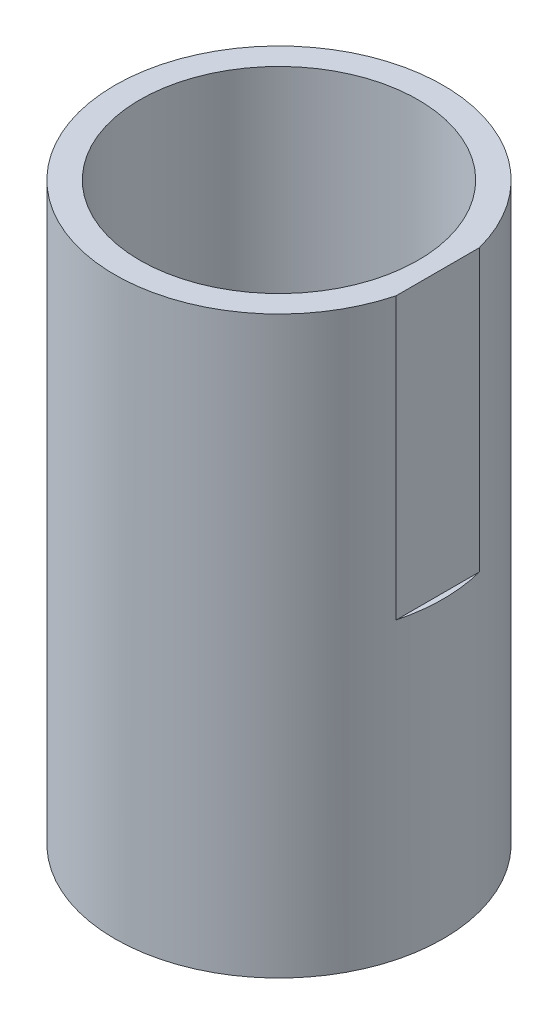
ISO-10303-21;
HEADER;
FILE_DESCRIPTION(('STEP AP214'),'2;1');
FILE_NAME('part.step','',(''),(''),'','','');
FILE_SCHEMA(('AUTOMOTIVE_DESIGN { 1 0 10303 214 1 1 1 1 }'));
ENDSEC;
DATA;
#1=APPLICATION_CONTEXT('core data for automotive mechanical design processes');
#2=APPLICATION_PROTOCOL_DEFINITION('international standard','automotive_design',2000,#1);
#3=PRODUCT_CONTEXT('',#1,'mechanical');
#4=PRODUCT('Part','Part','',(#3));
#5=PRODUCT_RELATED_PRODUCT_CATEGORY('part','',(#4));
#6=PRODUCT_DEFINITION_FORMATION('','',#4);
#7=PRODUCT_DEFINITION_CONTEXT('part definition',#1,'design');
#8=PRODUCT_DEFINITION('design','',#6,#7);
#9=PRODUCT_DEFINITION_SHAPE('','',#8);
#10=(LENGTH_UNIT() NAMED_UNIT(*) SI_UNIT(.MILLI.,.METRE.));
#11=(NAMED_UNIT(*) PLANE_ANGLE_UNIT() SI_UNIT($,.RADIAN.));
#12=(NAMED_UNIT(*) SI_UNIT($,.STERADIAN.) SOLID_ANGLE_UNIT());
#13=UNCERTAINTY_MEASURE_WITH_UNIT(LENGTH_MEASURE(1.E-05),#10,'distance_accuracy_value','');
#14=(GEOMETRIC_REPRESENTATION_CONTEXT(3) GLOBAL_UNCERTAINTY_ASSIGNED_CONTEXT((#13)) GLOBAL_UNIT_ASSIGNED_CONTEXT((#10,
#11,#12)) REPRESENTATION_CONTEXT('',''));
#15=CARTESIAN_POINT('',(0.,0.,0.));
#16=DIRECTION('',(0.,0.,1.));
#17=DIRECTION('',(1.,0.,0.));
#18=AXIS2_PLACEMENT_3D('',#15,#16,#17);
#19=CARTESIAN_POINT('',(0.,42.2656,0.));
#20=DIRECTION('',(0.,1.,0.));
#21=DIRECTION('',(0.,0.,1.));
#22=AXIS2_PLACEMENT_3D('',#19,#20,#21);
#23=PLANE('',#22);
#24=DIRECTION('',(0.,0.,1.));
#25=VECTOR('',#24,1.);
#26=CARTESIAN_POINT('',(23.3426,42.2656,6.35));
#27=LINE('',#26,#25);
#28=CARTESIAN_POINT('',(23.3426,42.2656,-6.1139124331315));
#29=VERTEX_POINT('',#28);
#30=CARTESIAN_POINT('',(23.3426,42.2656,6.1139124331315));
#31=VERTEX_POINT('',#30);
#32=EDGE_CURVE('E50',#29,#31,#27,.T.);
#33=ORIENTED_EDGE('',*,*,#32,.F.);
#34=CARTESIAN_POINT('',(0.,42.2656,0.));
#35=DIRECTION('',(0.,1.,0.));
#36=DIRECTION('',(0.,0.,1.));
#37=AXIS2_PLACEMENT_3D('',#34,#35,#36);
#38=CIRCLE('',#37,24.13);
#39=EDGE_CURVE('E71',#29,#31,#38,.T.);
#40=ORIENTED_EDGE('',*,*,#39,.T.);
#41=EDGE_LOOP('',(#33,#40));
#42=FACE_BOUND('',#41,.T.);
#43=CARTESIAN_POINT('',(0.,42.2656,0.));
#44=DIRECTION('',(0.,1.,0.));
#45=DIRECTION('',(0.,0.,1.));
#46=AXIS2_PLACEMENT_3D('',#43,#44,#45);
#47=CIRCLE('',#46,20.447);
#48=CARTESIAN_POINT('',(0.,42.2656,20.447));
#49=VERTEX_POINT('',#48);
#50=EDGE_CURVE('E77',#49,#49,#47,.T.);
#51=ORIENTED_EDGE('',*,*,#50,.F.);
#52=EDGE_LOOP('',(#51));
#53=FACE_BOUND('',#52,.T.);
#54=ADVANCED_FACE('F35',(#42,#53),#23,.T.);
#55=CARTESIAN_POINT('',(0.,-42.2656,0.));
#56=DIRECTION('',(0.,1.,0.));
#57=DIRECTION('',(0.,0.,1.));
#58=AXIS2_PLACEMENT_3D('',#55,#56,#57);
#59=PLANE('',#58);
#60=CARTESIAN_POINT('',(0.,-42.2656,0.));
#61=DIRECTION('',(0.,1.,0.));
#62=DIRECTION('',(0.,0.,1.));
#63=AXIS2_PLACEMENT_3D('',#60,#61,#62);
#64=CIRCLE('',#63,24.13);
#65=CARTESIAN_POINT('',(0.,-42.2656,24.13));
#66=VERTEX_POINT('',#65);
#67=EDGE_CURVE('E73',#66,#66,#64,.T.);
#68=ORIENTED_EDGE('',*,*,#67,.F.);
#69=EDGE_LOOP('',(#68));
#70=FACE_BOUND('',#69,.T.);
#71=CARTESIAN_POINT('',(0.,-42.2656,0.));
#72=DIRECTION('',(0.,1.,0.));
#73=DIRECTION('',(0.,0.,1.));
#74=AXIS2_PLACEMENT_3D('',#71,#72,#73);
#75=CIRCLE('',#74,20.447);
#76=CARTESIAN_POINT('',(0.,-42.2656,20.447));
#77=VERTEX_POINT('',#76);
#78=EDGE_CURVE('E68',#77,#77,#75,.T.);
#79=ORIENTED_EDGE('',*,*,#78,.T.);
#80=EDGE_LOOP('',(#79));
#81=FACE_BOUND('',#80,.T.);
#82=ADVANCED_FACE('F89',(#70,#81),#59,.F.);
#83=CARTESIAN_POINT('',(0.,42.2656,0.));
#84=DIRECTION('',(0.,-1.,0.));
#85=DIRECTION('',(0.,0.,-1.));
#86=AXIS2_PLACEMENT_3D('',#83,#84,#85);
#87=CYLINDRICAL_SURFACE('',#86,24.13);
#88=DIRECTION('',(0.,-1.,0.));
#89=VECTOR('',#88,1.);
#90=CARTESIAN_POINT('',(23.3426,42.2656,-6.1139124331315));
#91=LINE('',#90,#89);
#92=CARTESIAN_POINT('',(23.3426,0.990599999999994,-6.1139124331315));
#93=VERTEX_POINT('',#92);
#94=EDGE_CURVE('E11',#29,#93,#91,.T.);
#95=ORIENTED_EDGE('',*,*,#94,.T.);
#96=CARTESIAN_POINT('',(0.,0.990599999999994,0.));
#97=DIRECTION('',(0.,-1.,0.));
#98=DIRECTION('',(0.,0.,-1.));
#99=AXIS2_PLACEMENT_3D('',#96,#97,#98);
#100=CIRCLE('',#99,24.13);
#101=CARTESIAN_POINT('',(23.3426,0.990599999999994,6.1139124331315));
#102=VERTEX_POINT('',#101);
#103=EDGE_CURVE('E65',#93,#102,#100,.T.);
#104=ORIENTED_EDGE('',*,*,#103,.T.);
#105=DIRECTION('',(0.,-1.,0.));
#106=VECTOR('',#105,1.);
#107=CARTESIAN_POINT('',(23.3426,42.2656,6.1139124331315));
#108=LINE('',#107,#106);
#109=EDGE_CURVE('E43',#102,#31,#108,.F.);
#110=ORIENTED_EDGE('',*,*,#109,.T.);
#111=ORIENTED_EDGE('',*,*,#39,.F.);
#112=EDGE_LOOP('',(#95,#104,#110,#111));
#113=FACE_BOUND('',#112,.T.);
#114=ORIENTED_EDGE('',*,*,#67,.T.);
#115=EDGE_LOOP('',(#114));
#116=FACE_BOUND('',#115,.T.);
#117=ADVANCED_FACE('F37',(#113,#116),#87,.T.);
#118=CARTESIAN_POINT('',(0.,42.2656,0.));
#119=DIRECTION('',(0.,-1.,0.));
#120=DIRECTION('',(0.,0.,-1.));
#121=AXIS2_PLACEMENT_3D('',#118,#119,#120);
#122=CYLINDRICAL_SURFACE('',#121,20.447);
#123=ORIENTED_EDGE('',*,*,#50,.T.);
#124=EDGE_LOOP('',(#123));
#125=FACE_BOUND('',#124,.T.);
#126=ORIENTED_EDGE('',*,*,#78,.F.);
#127=EDGE_LOOP('',(#126));
#128=FACE_BOUND('',#127,.T.);
#129=ADVANCED_FACE('F85',(#125,#128),#122,.F.);
#130=CARTESIAN_POINT('',(23.3426,0.990599999999994,6.35));
#131=DIRECTION('',(0.,-1.,0.));
#132=DIRECTION('',(0.,0.,-1.));
#133=AXIS2_PLACEMENT_3D('',#130,#131,#132);
#134=PLANE('',#133);
#135=DIRECTION('',(0.,0.,-1.));
#136=VECTOR('',#135,1.);
#137=CARTESIAN_POINT('',(23.3426,0.990599999999994,6.35));
#138=LINE('',#137,#136);
#139=EDGE_CURVE('E60',#102,#93,#138,.T.);
#140=ORIENTED_EDGE('',*,*,#139,.F.);
#141=ORIENTED_EDGE('',*,*,#103,.F.);
#142=EDGE_LOOP('',(#140,#141));
#143=FACE_BOUND('',#142,.T.);
#144=ADVANCED_FACE('F67',(#143),#134,.F.);
#145=CARTESIAN_POINT('',(23.3426,0.,0.));
#146=DIRECTION('',(-1.,0.,0.));
#147=DIRECTION('',(0.,0.,1.));
#148=AXIS2_PLACEMENT_3D('',#145,#146,#147);
#149=PLANE('',#148);
#150=ORIENTED_EDGE('',*,*,#32,.T.);
#151=ORIENTED_EDGE('',*,*,#109,.F.);
#152=ORIENTED_EDGE('',*,*,#139,.T.);
#153=ORIENTED_EDGE('',*,*,#94,.F.);
#154=EDGE_LOOP('',(#150,#151,#152,#153));
#155=FACE_BOUND('',#154,.T.);
#156=ADVANCED_FACE('F59',(#155),#149,.F.);
#157=CLOSED_SHELL('',(#54,#82,#117,#129,#144,#156));
#158=MANIFOLD_SOLID_BREP('B2',#157);
#159=ADVANCED_BREP_SHAPE_REPRESENTATION('',(#18,#158),#14);
#160=SHAPE_DEFINITION_REPRESENTATION(#9,#159);
ENDSEC;
END-ISO-10303-21;
